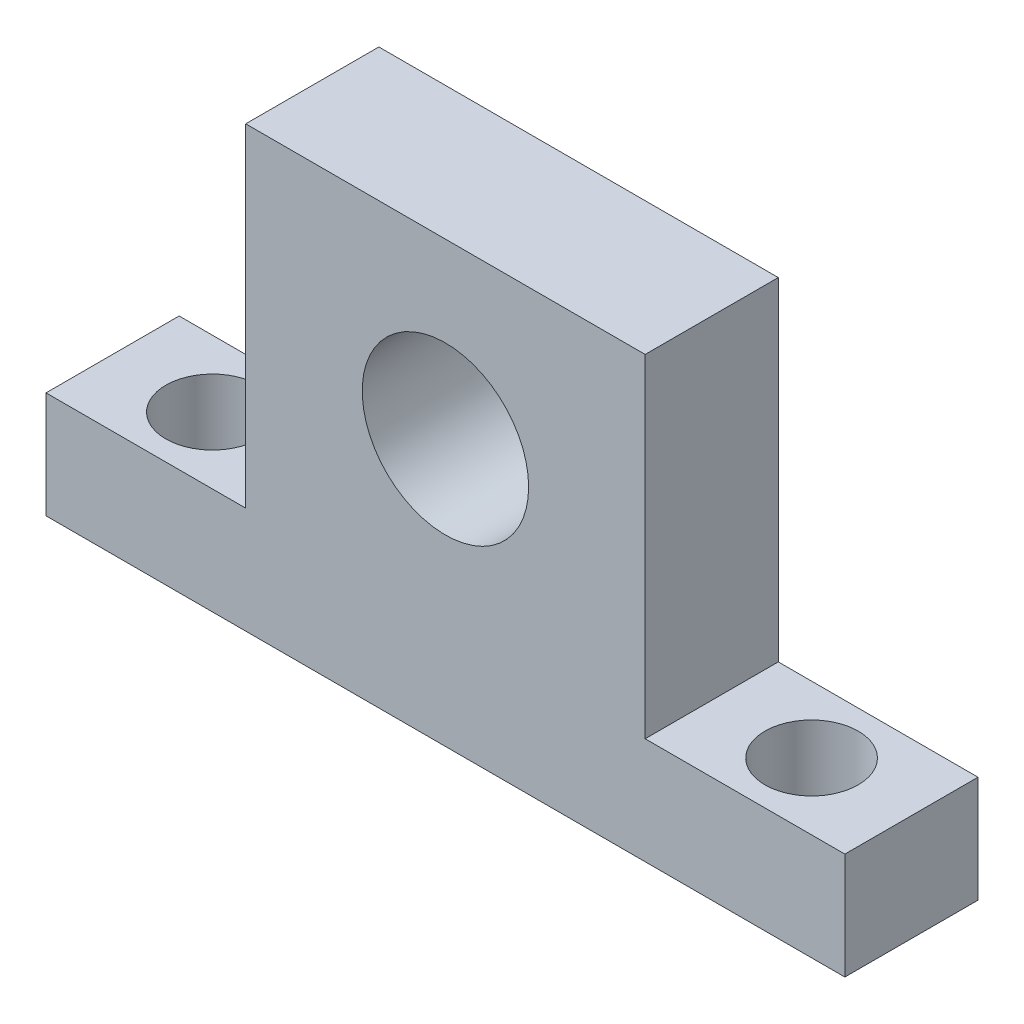
ISO-10303-21;
HEADER;
FILE_DESCRIPTION(('STEP AP214'),'2;1');
FILE_NAME('part.step','',(''),(''),'','','');
FILE_SCHEMA(('AUTOMOTIVE_DESIGN { 1 0 10303 214 1 1 1 1 }'));
ENDSEC;
DATA;
#1=APPLICATION_CONTEXT('core data for automotive mechanical design processes');
#2=APPLICATION_PROTOCOL_DEFINITION('international standard','automotive_design',2000,#1);
#3=PRODUCT_CONTEXT('',#1,'mechanical');
#4=PRODUCT('Part','Part','',(#3));
#5=PRODUCT_RELATED_PRODUCT_CATEGORY('part','',(#4));
#6=PRODUCT_DEFINITION_FORMATION('','',#4);
#7=PRODUCT_DEFINITION_CONTEXT('part definition',#1,'design');
#8=PRODUCT_DEFINITION('design','',#6,#7);
#9=PRODUCT_DEFINITION_SHAPE('','',#8);
#10=(LENGTH_UNIT() NAMED_UNIT(*) SI_UNIT(.MILLI.,.METRE.));
#11=(NAMED_UNIT(*) PLANE_ANGLE_UNIT() SI_UNIT($,.RADIAN.));
#12=(NAMED_UNIT(*) SI_UNIT($,.STERADIAN.) SOLID_ANGLE_UNIT());
#13=UNCERTAINTY_MEASURE_WITH_UNIT(LENGTH_MEASURE(1.E-05),#10,'distance_accuracy_value','');
#14=(GEOMETRIC_REPRESENTATION_CONTEXT(3) GLOBAL_UNCERTAINTY_ASSIGNED_CONTEXT((#13)) GLOBAL_UNIT_ASSIGNED_CONTEXT((#10,
#11,#12)) REPRESENTATION_CONTEXT('',''));
#15=CARTESIAN_POINT('',(0.,0.,0.));
#16=DIRECTION('',(0.,0.,1.));
#17=DIRECTION('',(1.,0.,0.));
#18=AXIS2_PLACEMENT_3D('',#15,#16,#17);
#19=CARTESIAN_POINT('',(0.,0.,10.));
#20=DIRECTION('',(0.,0.,1.));
#21=DIRECTION('',(1.,0.,0.));
#22=AXIS2_PLACEMENT_3D('',#19,#20,#21);
#23=PLANE('',#22);
#24=DIRECTION('',(1.,0.,0.));
#25=VECTOR('',#24,1.);
#26=CARTESIAN_POINT('',(-15.,0.,10.));
#27=LINE('',#26,#25);
#28=CARTESIAN_POINT('',(-15.,0.,10.));
#29=VERTEX_POINT('',#28);
#30=CARTESIAN_POINT('',(0.,0.,10.));
#31=VERTEX_POINT('',#30);
#32=EDGE_CURVE('E179',#29,#31,#27,.T.);
#33=ORIENTED_EDGE('',*,*,#32,.F.);
#34=DIRECTION('',(0.,-1.,0.));
#35=VECTOR('',#34,1.);
#36=CARTESIAN_POINT('',(-15.,0.,10.));
#37=LINE('',#36,#35);
#38=CARTESIAN_POINT('',(-15.,-8.,10.));
#39=VERTEX_POINT('',#38);
#40=EDGE_CURVE('E139',#29,#39,#37,.T.);
#41=ORIENTED_EDGE('',*,*,#40,.T.);
#42=DIRECTION('',(1.,0.,0.));
#43=VECTOR('',#42,1.);
#44=CARTESIAN_POINT('',(-15.,-8.,10.));
#45=LINE('',#44,#43);
#46=CARTESIAN_POINT('',(45.,-8.,10.));
#47=VERTEX_POINT('',#46);
#48=EDGE_CURVE('E131',#39,#47,#45,.T.);
#49=ORIENTED_EDGE('',*,*,#48,.T.);
#50=DIRECTION('',(0.,-1.,0.));
#51=VECTOR('',#50,1.);
#52=CARTESIAN_POINT('',(45.,0.,10.));
#53=LINE('',#52,#51);
#54=CARTESIAN_POINT('',(45.,0.,10.));
#55=VERTEX_POINT('',#54);
#56=EDGE_CURVE('E137',#55,#47,#53,.T.);
#57=ORIENTED_EDGE('',*,*,#56,.F.);
#58=DIRECTION('',(1.,0.,0.));
#59=VECTOR('',#58,1.);
#60=CARTESIAN_POINT('',(30.,0.,10.));
#61=LINE('',#60,#59);
#62=CARTESIAN_POINT('',(30.,0.,10.));
#63=VERTEX_POINT('',#62);
#64=EDGE_CURVE('E153',#63,#55,#61,.T.);
#65=ORIENTED_EDGE('',*,*,#64,.F.);
#66=DIRECTION('',(0.,1.,0.));
#67=VECTOR('',#66,1.);
#68=CARTESIAN_POINT('',(30.,0.,10.));
#69=LINE('',#68,#67);
#70=CARTESIAN_POINT('',(30.,25.,10.));
#71=VERTEX_POINT('',#70);
#72=EDGE_CURVE('E155',#63,#71,#69,.T.);
#73=ORIENTED_EDGE('',*,*,#72,.T.);
#74=DIRECTION('',(1.,0.,0.));
#75=VECTOR('',#74,1.);
#76=CARTESIAN_POINT('',(0.,25.,10.));
#77=LINE('',#76,#75);
#78=CARTESIAN_POINT('',(0.,25.,10.));
#79=VERTEX_POINT('',#78);
#80=EDGE_CURVE('E200',#79,#71,#77,.T.);
#81=ORIENTED_EDGE('',*,*,#80,.F.);
#82=DIRECTION('',(0.,1.,0.));
#83=VECTOR('',#82,1.);
#84=CARTESIAN_POINT('',(0.,0.,10.));
#85=LINE('',#84,#83);
#86=EDGE_CURVE('E205',#31,#79,#85,.T.);
#87=ORIENTED_EDGE('',*,*,#86,.F.);
#88=EDGE_LOOP('',(#33,#41,#49,#57,#65,#73,#81,#87));
#89=FACE_BOUND('',#88,.T.);
#90=CARTESIAN_POINT('',(15.,12.,10.));
#91=DIRECTION('',(0.,0.,1.));
#92=DIRECTION('',(1.,0.,0.));
#93=AXIS2_PLACEMENT_3D('',#90,#91,#92);
#94=CIRCLE('',#93,6.25);
#95=CARTESIAN_POINT('',(21.25,12.,10.));
#96=VERTEX_POINT('',#95);
#97=EDGE_CURVE('E164',#96,#96,#94,.T.);
#98=ORIENTED_EDGE('',*,*,#97,.F.);
#99=EDGE_LOOP('',(#98));
#100=FACE_BOUND('',#99,.T.);
#101=ADVANCED_FACE('F60',(#89,#100),#23,.T.);
#102=CARTESIAN_POINT('',(0.,0.,0.));
#103=DIRECTION('',(0.,0.,1.));
#104=DIRECTION('',(1.,0.,0.));
#105=AXIS2_PLACEMENT_3D('',#102,#103,#104);
#106=PLANE('',#105);
#107=DIRECTION('',(1.,0.,0.));
#108=VECTOR('',#107,1.);
#109=CARTESIAN_POINT('',(-15.,0.,0.));
#110=LINE('',#109,#108);
#111=CARTESIAN_POINT('',(-15.,0.,0.));
#112=VERTEX_POINT('',#111);
#113=CARTESIAN_POINT('',(0.,0.,0.));
#114=VERTEX_POINT('',#113);
#115=EDGE_CURVE('E160',#112,#114,#110,.T.);
#116=ORIENTED_EDGE('',*,*,#115,.T.);
#117=DIRECTION('',(0.,1.,0.));
#118=VECTOR('',#117,1.);
#119=CARTESIAN_POINT('',(0.,0.,0.));
#120=LINE('',#119,#118);
#121=CARTESIAN_POINT('',(0.,25.,0.));
#122=VERTEX_POINT('',#121);
#123=EDGE_CURVE('E163',#114,#122,#120,.T.);
#124=ORIENTED_EDGE('',*,*,#123,.T.);
#125=DIRECTION('',(1.,0.,0.));
#126=VECTOR('',#125,1.);
#127=CARTESIAN_POINT('',(0.,25.,0.));
#128=LINE('',#127,#126);
#129=CARTESIAN_POINT('',(30.,25.,0.));
#130=VERTEX_POINT('',#129);
#131=EDGE_CURVE('E167',#122,#130,#128,.T.);
#132=ORIENTED_EDGE('',*,*,#131,.T.);
#133=DIRECTION('',(0.,1.,0.));
#134=VECTOR('',#133,1.);
#135=CARTESIAN_POINT('',(30.,0.,0.));
#136=LINE('',#135,#134);
#137=CARTESIAN_POINT('',(30.,0.,0.));
#138=VERTEX_POINT('',#137);
#139=EDGE_CURVE('E170',#138,#130,#136,.T.);
#140=ORIENTED_EDGE('',*,*,#139,.F.);
#141=DIRECTION('',(1.,0.,0.));
#142=VECTOR('',#141,1.);
#143=CARTESIAN_POINT('',(30.,0.,0.));
#144=LINE('',#143,#142);
#145=CARTESIAN_POINT('',(45.,0.,0.));
#146=VERTEX_POINT('',#145);
#147=EDGE_CURVE('E173',#138,#146,#144,.T.);
#148=ORIENTED_EDGE('',*,*,#147,.T.);
#149=DIRECTION('',(0.,-1.,0.));
#150=VECTOR('',#149,1.);
#151=CARTESIAN_POINT('',(45.,0.,0.));
#152=LINE('',#151,#150);
#153=CARTESIAN_POINT('',(45.,-8.,0.));
#154=VERTEX_POINT('',#153);
#155=EDGE_CURVE('E176',#146,#154,#152,.T.);
#156=ORIENTED_EDGE('',*,*,#155,.T.);
#157=DIRECTION('',(1.,0.,0.));
#158=VECTOR('',#157,1.);
#159=CARTESIAN_POINT('',(-15.,-8.,0.));
#160=LINE('',#159,#158);
#161=CARTESIAN_POINT('',(-15.,-8.,0.));
#162=VERTEX_POINT('',#161);
#163=EDGE_CURVE('E146',#162,#154,#160,.T.);
#164=ORIENTED_EDGE('',*,*,#163,.F.);
#165=DIRECTION('',(0.,-1.,0.));
#166=VECTOR('',#165,1.);
#167=CARTESIAN_POINT('',(-15.,0.,0.));
#168=LINE('',#167,#166);
#169=EDGE_CURVE('E106',#112,#162,#168,.T.);
#170=ORIENTED_EDGE('',*,*,#169,.F.);
#171=EDGE_LOOP('',(#116,#124,#132,#140,#148,#156,#164,#170));
#172=FACE_BOUND('',#171,.T.);
#173=CARTESIAN_POINT('',(15.,12.,0.));
#174=DIRECTION('',(0.,0.,1.));
#175=DIRECTION('',(1.,0.,0.));
#176=AXIS2_PLACEMENT_3D('',#173,#174,#175);
#177=CIRCLE('',#176,6.25);
#178=CARTESIAN_POINT('',(21.25,12.,0.));
#179=VERTEX_POINT('',#178);
#180=EDGE_CURVE('E210',#179,#179,#177,.T.);
#181=ORIENTED_EDGE('',*,*,#180,.T.);
#182=EDGE_LOOP('',(#181));
#183=FACE_BOUND('',#182,.T.);
#184=ADVANCED_FACE('F190',(#172,#183),#106,.F.);
#185=CARTESIAN_POINT('',(-15.,0.,10.));
#186=DIRECTION('',(0.,1.,0.));
#187=DIRECTION('',(0.,0.,1.));
#188=AXIS2_PLACEMENT_3D('',#185,#186,#187);
#189=PLANE('',#188);
#190=CARTESIAN_POINT('',(-7.5,0.,5.));
#191=DIRECTION('',(0.,1.,0.));
#192=DIRECTION('',(0.,0.,1.));
#193=AXIS2_PLACEMENT_3D('',#190,#191,#192);
#194=CIRCLE('',#193,3.5);
#195=CARTESIAN_POINT('',(-7.5,0.,8.5));
#196=VERTEX_POINT('',#195);
#197=EDGE_CURVE('E222',#196,#196,#194,.T.);
#198=ORIENTED_EDGE('',*,*,#197,.F.);
#199=EDGE_LOOP('',(#198));
#200=FACE_BOUND('',#199,.T.);
#201=ORIENTED_EDGE('',*,*,#115,.F.);
#202=DIRECTION('',(0.,0.,-1.));
#203=VECTOR('',#202,1.);
#204=CARTESIAN_POINT('',(-15.,0.,10.));
#205=LINE('',#204,#203);
#206=EDGE_CURVE('E12',#29,#112,#205,.T.);
#207=ORIENTED_EDGE('',*,*,#206,.F.);
#208=ORIENTED_EDGE('',*,*,#32,.T.);
#209=DIRECTION('',(0.,0.,-1.));
#210=VECTOR('',#209,1.);
#211=CARTESIAN_POINT('',(0.,0.,10.));
#212=LINE('',#211,#210);
#213=EDGE_CURVE('E64',#31,#114,#212,.T.);
#214=ORIENTED_EDGE('',*,*,#213,.T.);
#215=EDGE_LOOP('',(#201,#207,#208,#214));
#216=FACE_BOUND('',#215,.T.);
#217=ADVANCED_FACE('F62',(#200,#216),#189,.T.);
#218=CARTESIAN_POINT('',(-15.,0.,10.));
#219=DIRECTION('',(1.,0.,0.));
#220=DIRECTION('',(0.,1.,0.));
#221=AXIS2_PLACEMENT_3D('',#218,#219,#220);
#222=PLANE('',#221);
#223=ORIENTED_EDGE('',*,*,#169,.T.);
#224=DIRECTION('',(0.,0.,-1.));
#225=VECTOR('',#224,1.);
#226=CARTESIAN_POINT('',(-15.,-8.,10.));
#227=LINE('',#226,#225);
#228=EDGE_CURVE('E70',#39,#162,#227,.T.);
#229=ORIENTED_EDGE('',*,*,#228,.F.);
#230=ORIENTED_EDGE('',*,*,#40,.F.);
#231=ORIENTED_EDGE('',*,*,#206,.T.);
#232=EDGE_LOOP('',(#223,#229,#230,#231));
#233=FACE_BOUND('',#232,.T.);
#234=ADVANCED_FACE('F238',(#233),#222,.F.);
#235=CARTESIAN_POINT('',(-15.,-8.,10.));
#236=DIRECTION('',(0.,1.,0.));
#237=DIRECTION('',(0.,0.,1.));
#238=AXIS2_PLACEMENT_3D('',#235,#236,#237);
#239=PLANE('',#238);
#240=CARTESIAN_POINT('',(-7.5,-8.,5.));
#241=DIRECTION('',(0.,1.,0.));
#242=DIRECTION('',(0.,0.,1.));
#243=AXIS2_PLACEMENT_3D('',#240,#241,#242);
#244=CIRCLE('',#243,3.5);
#245=CARTESIAN_POINT('',(-7.5,-8.,8.5));
#246=VERTEX_POINT('',#245);
#247=EDGE_CURVE('E219',#246,#246,#244,.T.);
#248=ORIENTED_EDGE('',*,*,#247,.T.);
#249=EDGE_LOOP('',(#248));
#250=FACE_BOUND('',#249,.T.);
#251=CARTESIAN_POINT('',(37.5,-8.,5.));
#252=DIRECTION('',(0.,1.,0.));
#253=DIRECTION('',(0.,0.,1.));
#254=AXIS2_PLACEMENT_3D('',#251,#252,#253);
#255=CIRCLE('',#254,3.5);
#256=CARTESIAN_POINT('',(37.5,-8.,8.5));
#257=VERTEX_POINT('',#256);
#258=EDGE_CURVE('E213',#257,#257,#255,.T.);
#259=ORIENTED_EDGE('',*,*,#258,.T.);
#260=EDGE_LOOP('',(#259));
#261=FACE_BOUND('',#260,.T.);
#262=ORIENTED_EDGE('',*,*,#163,.T.);
#263=DIRECTION('',(0.,0.,-1.));
#264=VECTOR('',#263,1.);
#265=CARTESIAN_POINT('',(45.,-8.,10.));
#266=LINE('',#265,#264);
#267=EDGE_CURVE('E143',#47,#154,#266,.T.);
#268=ORIENTED_EDGE('',*,*,#267,.F.);
#269=ORIENTED_EDGE('',*,*,#48,.F.);
#270=ORIENTED_EDGE('',*,*,#228,.T.);
#271=EDGE_LOOP('',(#262,#268,#269,#270));
#272=FACE_BOUND('',#271,.T.);
#273=ADVANCED_FACE('F144',(#250,#261,#272),#239,.F.);
#274=CARTESIAN_POINT('',(45.,0.,10.));
#275=DIRECTION('',(1.,0.,0.));
#276=DIRECTION('',(0.,0.,-1.));
#277=AXIS2_PLACEMENT_3D('',#274,#275,#276);
#278=PLANE('',#277);
#279=ORIENTED_EDGE('',*,*,#155,.F.);
#280=DIRECTION('',(0.,0.,-1.));
#281=VECTOR('',#280,1.);
#282=CARTESIAN_POINT('',(45.,0.,10.));
#283=LINE('',#282,#281);
#284=EDGE_CURVE('E150',#55,#146,#283,.T.);
#285=ORIENTED_EDGE('',*,*,#284,.F.);
#286=ORIENTED_EDGE('',*,*,#56,.T.);
#287=ORIENTED_EDGE('',*,*,#267,.T.);
#288=EDGE_LOOP('',(#279,#285,#286,#287));
#289=FACE_BOUND('',#288,.T.);
#290=ADVANCED_FACE('F152',(#289),#278,.T.);
#291=CARTESIAN_POINT('',(30.,0.,10.));
#292=DIRECTION('',(0.,1.,0.));
#293=DIRECTION('',(0.,0.,1.));
#294=AXIS2_PLACEMENT_3D('',#291,#292,#293);
#295=PLANE('',#294);
#296=CARTESIAN_POINT('',(37.5,0.,5.));
#297=DIRECTION('',(0.,1.,0.));
#298=DIRECTION('',(0.,0.,1.));
#299=AXIS2_PLACEMENT_3D('',#296,#297,#298);
#300=CIRCLE('',#299,3.5);
#301=CARTESIAN_POINT('',(37.5,0.,8.5));
#302=VERTEX_POINT('',#301);
#303=EDGE_CURVE('E216',#302,#302,#300,.T.);
#304=ORIENTED_EDGE('',*,*,#303,.F.);
#305=EDGE_LOOP('',(#304));
#306=FACE_BOUND('',#305,.T.);
#307=ORIENTED_EDGE('',*,*,#147,.F.);
#308=DIRECTION('',(0.,0.,-1.));
#309=VECTOR('',#308,1.);
#310=CARTESIAN_POINT('',(30.,0.,10.));
#311=LINE('',#310,#309);
#312=EDGE_CURVE('E183',#63,#138,#311,.T.);
#313=ORIENTED_EDGE('',*,*,#312,.F.);
#314=ORIENTED_EDGE('',*,*,#64,.T.);
#315=ORIENTED_EDGE('',*,*,#284,.T.);
#316=EDGE_LOOP('',(#307,#313,#314,#315));
#317=FACE_BOUND('',#316,.T.);
#318=ADVANCED_FACE('F195',(#306,#317),#295,.T.);
#319=CARTESIAN_POINT('',(30.,0.,10.));
#320=DIRECTION('',(-1.,0.,0.));
#321=DIRECTION('',(0.,-1.,0.));
#322=AXIS2_PLACEMENT_3D('',#319,#320,#321);
#323=PLANE('',#322);
#324=ORIENTED_EDGE('',*,*,#139,.T.);
#325=DIRECTION('',(0.,0.,-1.));
#326=VECTOR('',#325,1.);
#327=CARTESIAN_POINT('',(30.,25.,10.));
#328=LINE('',#327,#326);
#329=EDGE_CURVE('E185',#71,#130,#328,.T.);
#330=ORIENTED_EDGE('',*,*,#329,.F.);
#331=ORIENTED_EDGE('',*,*,#72,.F.);
#332=ORIENTED_EDGE('',*,*,#312,.T.);
#333=EDGE_LOOP('',(#324,#330,#331,#332));
#334=FACE_BOUND('',#333,.T.);
#335=ADVANCED_FACE('F202',(#334),#323,.F.);
#336=CARTESIAN_POINT('',(0.,25.,10.));
#337=DIRECTION('',(0.,1.,0.));
#338=DIRECTION('',(0.,0.,1.));
#339=AXIS2_PLACEMENT_3D('',#336,#337,#338);
#340=PLANE('',#339);
#341=ORIENTED_EDGE('',*,*,#131,.F.);
#342=DIRECTION('',(0.,0.,-1.));
#343=VECTOR('',#342,1.);
#344=CARTESIAN_POINT('',(0.,25.,10.));
#345=LINE('',#344,#343);
#346=EDGE_CURVE('E186',#79,#122,#345,.T.);
#347=ORIENTED_EDGE('',*,*,#346,.F.);
#348=ORIENTED_EDGE('',*,*,#80,.T.);
#349=ORIENTED_EDGE('',*,*,#329,.T.);
#350=EDGE_LOOP('',(#341,#347,#348,#349));
#351=FACE_BOUND('',#350,.T.);
#352=ADVANCED_FACE('F204',(#351),#340,.T.);
#353=CARTESIAN_POINT('',(0.,0.,10.));
#354=DIRECTION('',(-1.,0.,0.));
#355=DIRECTION('',(0.,0.,1.));
#356=AXIS2_PLACEMENT_3D('',#353,#354,#355);
#357=PLANE('',#356);
#358=ORIENTED_EDGE('',*,*,#123,.F.);
#359=ORIENTED_EDGE('',*,*,#213,.F.);
#360=ORIENTED_EDGE('',*,*,#86,.T.);
#361=ORIENTED_EDGE('',*,*,#346,.T.);
#362=EDGE_LOOP('',(#358,#359,#360,#361));
#363=FACE_BOUND('',#362,.T.);
#364=ADVANCED_FACE('F188',(#363),#357,.T.);
#365=CARTESIAN_POINT('',(15.,12.,10.));
#366=DIRECTION('',(0.,0.,-1.));
#367=DIRECTION('',(-1.,0.,0.));
#368=AXIS2_PLACEMENT_3D('',#365,#366,#367);
#369=CYLINDRICAL_SURFACE('',#368,6.25);
#370=ORIENTED_EDGE('',*,*,#97,.T.);
#371=EDGE_LOOP('',(#370));
#372=FACE_BOUND('',#371,.T.);
#373=ORIENTED_EDGE('',*,*,#180,.F.);
#374=EDGE_LOOP('',(#373));
#375=FACE_BOUND('',#374,.T.);
#376=ADVANCED_FACE('F250',(#372,#375),#369,.F.);
#377=CARTESIAN_POINT('',(37.5,-8.,5.));
#378=DIRECTION('',(0.,1.,0.));
#379=DIRECTION('',(0.,0.,1.));
#380=AXIS2_PLACEMENT_3D('',#377,#378,#379);
#381=CYLINDRICAL_SURFACE('',#380,3.5);
#382=ORIENTED_EDGE('',*,*,#258,.F.);
#383=EDGE_LOOP('',(#382));
#384=FACE_BOUND('',#383,.T.);
#385=ORIENTED_EDGE('',*,*,#303,.T.);
#386=EDGE_LOOP('',(#385));
#387=FACE_BOUND('',#386,.T.);
#388=ADVANCED_FACE('F233',(#384,#387),#381,.F.);
#389=CARTESIAN_POINT('',(-7.5,-8.,5.));
#390=DIRECTION('',(0.,1.,0.));
#391=DIRECTION('',(0.,0.,1.));
#392=AXIS2_PLACEMENT_3D('',#389,#390,#391);
#393=CYLINDRICAL_SURFACE('',#392,3.5);
#394=ORIENTED_EDGE('',*,*,#247,.F.);
#395=EDGE_LOOP('',(#394));
#396=FACE_BOUND('',#395,.T.);
#397=ORIENTED_EDGE('',*,*,#197,.T.);
#398=EDGE_LOOP('',(#397));
#399=FACE_BOUND('',#398,.T.);
#400=ADVANCED_FACE('F230',(#396,#399),#393,.F.);
#401=CLOSED_SHELL('',(#101,#184,#217,#234,#273,#290,#318,#335,#352,#364,#376,#388,#400));
#402=MANIFOLD_SOLID_BREP('B2',#401);
#403=ADVANCED_BREP_SHAPE_REPRESENTATION('',(#18,#402),#14);
#404=SHAPE_DEFINITION_REPRESENTATION(#9,#403);
ENDSEC;
END-ISO-10303-21;
